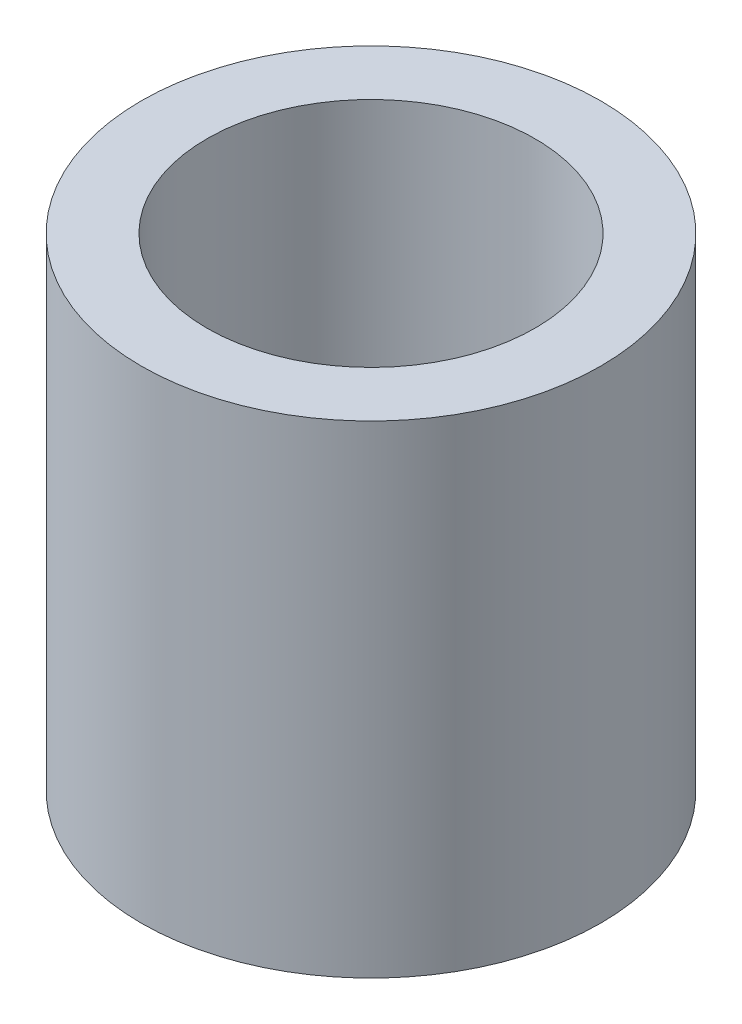
ISO-10303-21;
HEADER;
FILE_DESCRIPTION(('STEP AP214'),'2;1');
FILE_NAME('part.step','',(''),(''),'','','');
FILE_SCHEMA(('AUTOMOTIVE_DESIGN { 1 0 10303 214 1 1 1 1 }'));
ENDSEC;
DATA;
#1=APPLICATION_CONTEXT('core data for automotive mechanical design processes');
#2=APPLICATION_PROTOCOL_DEFINITION('international standard','automotive_design',2000,#1);
#3=PRODUCT_CONTEXT('',#1,'mechanical');
#4=PRODUCT('Part','Part','',(#3));
#5=PRODUCT_RELATED_PRODUCT_CATEGORY('part','',(#4));
#6=PRODUCT_DEFINITION_FORMATION('','',#4);
#7=PRODUCT_DEFINITION_CONTEXT('part definition',#1,'design');
#8=PRODUCT_DEFINITION('design','',#6,#7);
#9=PRODUCT_DEFINITION_SHAPE('','',#8);
#10=(LENGTH_UNIT() NAMED_UNIT(*) SI_UNIT(.MILLI.,.METRE.));
#11=(NAMED_UNIT(*) PLANE_ANGLE_UNIT() SI_UNIT($,.RADIAN.));
#12=(NAMED_UNIT(*) SI_UNIT($,.STERADIAN.) SOLID_ANGLE_UNIT());
#13=UNCERTAINTY_MEASURE_WITH_UNIT(LENGTH_MEASURE(1.E-05),#10,'distance_accuracy_value','');
#14=(GEOMETRIC_REPRESENTATION_CONTEXT(3) GLOBAL_UNCERTAINTY_ASSIGNED_CONTEXT((#13)) GLOBAL_UNIT_ASSIGNED_CONTEXT((#10,
#11,#12)) REPRESENTATION_CONTEXT('',''));
#15=CARTESIAN_POINT('',(0.,0.,0.));
#16=DIRECTION('',(0.,0.,1.));
#17=DIRECTION('',(1.,0.,0.));
#18=AXIS2_PLACEMENT_3D('',#15,#16,#17);
#19=CARTESIAN_POINT('',(0.,7.35,0.));
#20=DIRECTION('',(0.,1.,0.));
#21=DIRECTION('',(0.,0.,1.));
#22=AXIS2_PLACEMENT_3D('',#19,#20,#21);
#23=PLANE('',#22);
#24=CARTESIAN_POINT('',(0.,7.35,0.));
#25=DIRECTION('',(0.,1.,0.));
#26=DIRECTION('',(0.,0.,1.));
#27=AXIS2_PLACEMENT_3D('',#24,#25,#26);
#28=CIRCLE('',#27,3.5);
#29=CARTESIAN_POINT('',(0.,7.35,3.5));
#30=VERTEX_POINT('',#29);
#31=EDGE_CURVE('E10',#30,#30,#28,.T.);
#32=ORIENTED_EDGE('',*,*,#31,.T.);
#33=EDGE_LOOP('',(#32));
#34=FACE_BOUND('',#33,.T.);
#35=CARTESIAN_POINT('',(0.,7.35,0.));
#36=DIRECTION('',(0.,1.,0.));
#37=DIRECTION('',(0.,0.,1.));
#38=AXIS2_PLACEMENT_3D('',#35,#36,#37);
#39=CIRCLE('',#38,2.5);
#40=CARTESIAN_POINT('',(0.,7.35,2.5));
#41=VERTEX_POINT('',#40);
#42=EDGE_CURVE('E58',#41,#41,#39,.T.);
#43=ORIENTED_EDGE('',*,*,#42,.F.);
#44=EDGE_LOOP('',(#43));
#45=FACE_BOUND('',#44,.T.);
#46=ADVANCED_FACE('F45',(#34,#45),#23,.T.);
#47=CARTESIAN_POINT('',(0.,0.,0.));
#48=DIRECTION('',(0.,1.,0.));
#49=DIRECTION('',(0.,0.,1.));
#50=AXIS2_PLACEMENT_3D('',#47,#48,#49);
#51=PLANE('',#50);
#52=CARTESIAN_POINT('',(0.,0.,0.));
#53=DIRECTION('',(0.,1.,0.));
#54=DIRECTION('',(0.,0.,1.));
#55=AXIS2_PLACEMENT_3D('',#52,#53,#54);
#56=CIRCLE('',#55,3.5);
#57=CARTESIAN_POINT('',(0.,0.,3.5));
#58=VERTEX_POINT('',#57);
#59=EDGE_CURVE('E49',#58,#58,#56,.T.);
#60=ORIENTED_EDGE('',*,*,#59,.F.);
#61=EDGE_LOOP('',(#60));
#62=FACE_BOUND('',#61,.T.);
#63=CARTESIAN_POINT('',(0.,0.,0.));
#64=DIRECTION('',(0.,1.,0.));
#65=DIRECTION('',(0.,0.,1.));
#66=AXIS2_PLACEMENT_3D('',#63,#64,#65);
#67=CIRCLE('',#66,2.5);
#68=CARTESIAN_POINT('',(0.,0.,2.5));
#69=VERTEX_POINT('',#68);
#70=EDGE_CURVE('E60',#69,#69,#67,.T.);
#71=ORIENTED_EDGE('',*,*,#70,.T.);
#72=EDGE_LOOP('',(#71));
#73=FACE_BOUND('',#72,.T.);
#74=ADVANCED_FACE('F72',(#62,#73),#51,.F.);
#75=CARTESIAN_POINT('',(0.,7.35,0.));
#76=DIRECTION('',(0.,-1.,0.));
#77=DIRECTION('',(0.,0.,-1.));
#78=AXIS2_PLACEMENT_3D('',#75,#76,#77);
#79=CYLINDRICAL_SURFACE('',#78,3.5);
#80=ORIENTED_EDGE('',*,*,#31,.F.);
#81=EDGE_LOOP('',(#80));
#82=FACE_BOUND('',#81,.T.);
#83=ORIENTED_EDGE('',*,*,#59,.T.);
#84=EDGE_LOOP('',(#83));
#85=FACE_BOUND('',#84,.T.);
#86=ADVANCED_FACE('F47',(#82,#85),#79,.T.);
#87=CARTESIAN_POINT('',(0.,7.35,0.));
#88=DIRECTION('',(0.,-1.,0.));
#89=DIRECTION('',(0.,0.,-1.));
#90=AXIS2_PLACEMENT_3D('',#87,#88,#89);
#91=CYLINDRICAL_SURFACE('',#90,2.5);
#92=ORIENTED_EDGE('',*,*,#42,.T.);
#93=EDGE_LOOP('',(#92));
#94=FACE_BOUND('',#93,.T.);
#95=ORIENTED_EDGE('',*,*,#70,.F.);
#96=EDGE_LOOP('',(#95));
#97=FACE_BOUND('',#96,.T.);
#98=ADVANCED_FACE('F68',(#94,#97),#91,.F.);
#99=CLOSED_SHELL('',(#46,#74,#86,#98));
#100=MANIFOLD_SOLID_BREP('B2',#99);
#101=ADVANCED_BREP_SHAPE_REPRESENTATION('',(#18,#100),#14);
#102=SHAPE_DEFINITION_REPRESENTATION(#9,#101);
ENDSEC;
END-ISO-10303-21;
